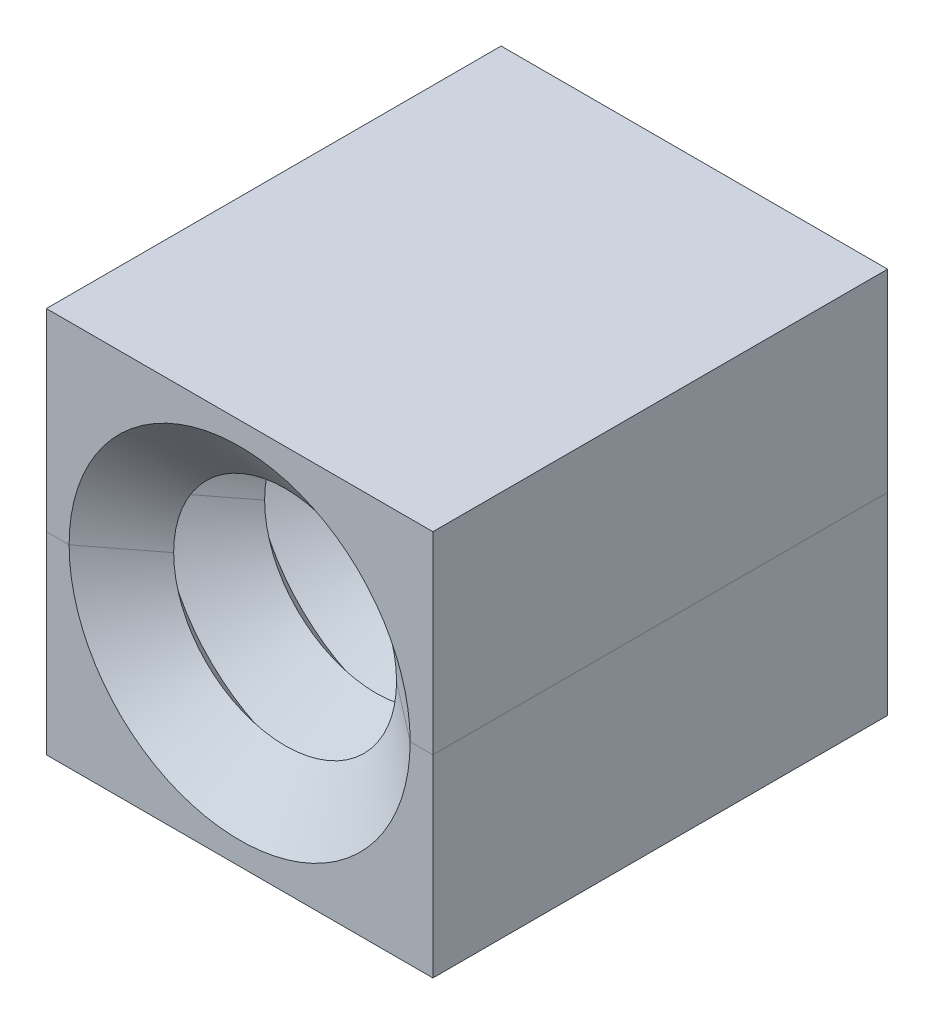
ISO-10303-21;
HEADER;
FILE_DESCRIPTION(('STEP AP214'),'2;1');
FILE_NAME('part.step','',(''),(''),'','','');
FILE_SCHEMA(('AUTOMOTIVE_DESIGN { 1 0 10303 214 1 1 1 1 }'));
ENDSEC;
DATA;
#1=APPLICATION_CONTEXT('core data for automotive mechanical design processes');
#2=APPLICATION_PROTOCOL_DEFINITION('international standard','automotive_design',2000,#1);
#3=PRODUCT_CONTEXT('',#1,'mechanical');
#4=PRODUCT('Part','Part','',(#3));
#5=PRODUCT_RELATED_PRODUCT_CATEGORY('part','',(#4));
#6=PRODUCT_DEFINITION_FORMATION('','',#4);
#7=PRODUCT_DEFINITION_CONTEXT('part definition',#1,'design');
#8=PRODUCT_DEFINITION('design','',#6,#7);
#9=PRODUCT_DEFINITION_SHAPE('','',#8);
#10=(LENGTH_UNIT() NAMED_UNIT(*) SI_UNIT(.MILLI.,.METRE.));
#11=(NAMED_UNIT(*) PLANE_ANGLE_UNIT() SI_UNIT($,.RADIAN.));
#12=(NAMED_UNIT(*) SI_UNIT($,.STERADIAN.) SOLID_ANGLE_UNIT());
#13=UNCERTAINTY_MEASURE_WITH_UNIT(LENGTH_MEASURE(1.E-05),#10,'distance_accuracy_value','');
#14=(GEOMETRIC_REPRESENTATION_CONTEXT(3) GLOBAL_UNCERTAINTY_ASSIGNED_CONTEXT((#13)) GLOBAL_UNIT_ASSIGNED_CONTEXT((#10,
#11,#12)) REPRESENTATION_CONTEXT('',''));
#15=CARTESIAN_POINT('',(0.,0.,0.));
#16=DIRECTION('',(0.,0.,1.));
#17=DIRECTION('',(1.,0.,0.));
#18=AXIS2_PLACEMENT_3D('',#15,#16,#17);
#19=CARTESIAN_POINT('',(0.,0.,0.));
#20=DIRECTION('',(0.,1.,0.));
#21=DIRECTION('',(0.,0.,1.));
#22=AXIS2_PLACEMENT_3D('',#19,#20,#21);
#23=PLANE('',#22);
#24=DIRECTION('',(0.792431530921342,0.,-0.609960874812195));
#25=VECTOR('',#24,1.);
#26=CARTESIAN_POINT('',(0.,0.,19.5459983167822));
#27=LINE('',#26,#25);
#28=CARTESIAN_POINT('',(15.,0.,7.99999999999999));
#29=VERTEX_POINT('',#28);
#30=CARTESIAN_POINT('',(9.80339435761134,0.,12.));
#31=VERTEX_POINT('',#30);
#32=EDGE_CURVE('E200',#29,#31,#27,.F.);
#33=ORIENTED_EDGE('',*,*,#32,.T.);
#34=DIRECTION('',(-0.792431530921343,0.,-0.609960874812194));
#35=VECTOR('',#34,1.);
#36=CARTESIAN_POINT('',(0.,0.,4.45400168321786));
#37=LINE('',#36,#35);
#38=CARTESIAN_POINT('',(15.,0.,16.));
#39=VERTEX_POINT('',#38);
#40=EDGE_CURVE('E411',#31,#39,#37,.F.);
#41=ORIENTED_EDGE('',*,*,#40,.T.);
#42=DIRECTION('',(0.792431530921342,0.,-0.609960874812195));
#43=VECTOR('',#42,1.);
#44=CARTESIAN_POINT('',(0.,0.,27.5459983167822));
#45=LINE('',#44,#43);
#46=CARTESIAN_POINT('',(9.80339435761134,0.,20.));
#47=VERTEX_POINT('',#46);
#48=EDGE_CURVE('E226',#39,#47,#45,.F.);
#49=ORIENTED_EDGE('',*,*,#48,.T.);
#50=DIRECTION('',(-0.792431530921343,0.,-0.609960874812194));
#51=VECTOR('',#50,1.);
#52=CARTESIAN_POINT('',(0.,0.,12.4540016832179));
#53=LINE('',#52,#51);
#54=CARTESIAN_POINT('',(15.,0.,24.));
#55=VERTEX_POINT('',#54);
#56=EDGE_CURVE('E234',#47,#55,#53,.F.);
#57=ORIENTED_EDGE('',*,*,#56,.T.);
#58=DIRECTION('',(0.792431530921342,0.,-0.609960874812195));
#59=VECTOR('',#58,1.);
#60=CARTESIAN_POINT('',(0.,0.,35.5459983167822));
#61=LINE('',#60,#59);
#62=CARTESIAN_POINT('',(9.80339435761134,0.,28.));
#63=VERTEX_POINT('',#62);
#64=EDGE_CURVE('E237',#55,#63,#61,.F.);
#65=ORIENTED_EDGE('',*,*,#64,.T.);
#66=DIRECTION('',(-0.792431530921343,0.,-0.609960874812194));
#67=VECTOR('',#66,1.);
#68=CARTESIAN_POINT('',(0.,0.,20.4540016832178));
#69=LINE('',#68,#67);
#70=CARTESIAN_POINT('',(15.,0.,32.));
#71=VERTEX_POINT('',#70);
#72=EDGE_CURVE('E246',#63,#71,#69,.F.);
#73=ORIENTED_EDGE('',*,*,#72,.T.);
#74=DIRECTION('',(1.,0.,0.));
#75=VECTOR('',#74,1.);
#76=CARTESIAN_POINT('',(-15.,0.,32.));
#77=LINE('',#76,#75);
#78=CARTESIAN_POINT('',(17.,0.,32.));
#79=VERTEX_POINT('',#78);
#80=EDGE_CURVE('E250',#71,#79,#77,.T.);
#81=ORIENTED_EDGE('',*,*,#80,.T.);
#82=DIRECTION('',(0.,0.,-1.));
#83=VECTOR('',#82,1.);
#84=CARTESIAN_POINT('',(17.,0.,35.));
#85=LINE('',#84,#83);
#86=CARTESIAN_POINT('',(17.,0.,-8.00000000000003));
#87=VERTEX_POINT('',#86);
#88=EDGE_CURVE('E157',#79,#87,#85,.T.);
#89=ORIENTED_EDGE('',*,*,#88,.T.);
#90=DIRECTION('',(-1.,0.,0.));
#91=VECTOR('',#90,1.);
#92=CARTESIAN_POINT('',(-11.3665165268692,0.,-8.00000000000003));
#93=LINE('',#92,#91);
#94=CARTESIAN_POINT('',(11.3665165268692,0.,-8.00000000000003));
#95=VERTEX_POINT('',#94);
#96=EDGE_CURVE('E158',#87,#95,#93,.T.);
#97=ORIENTED_EDGE('',*,*,#96,.T.);
#98=DIRECTION('',(-0.413531260199219,0.,-0.910489921326999));
#99=VECTOR('',#98,1.);
#100=CARTESIAN_POINT('',(0.,0.,-33.026158199807));
#101=LINE('',#100,#99);
#102=CARTESIAN_POINT('',(15.,0.,0.));
#103=VERTEX_POINT('',#102);
#104=EDGE_CURVE('E223',#95,#103,#101,.F.);
#105=ORIENTED_EDGE('',*,*,#104,.T.);
#106=DIRECTION('',(0.792431530921342,0.,-0.609960874812196));
#107=VECTOR('',#106,1.);
#108=CARTESIAN_POINT('',(0.,0.,11.5459983167822));
#109=LINE('',#108,#107);
#110=CARTESIAN_POINT('',(9.80339435761134,0.,4.));
#111=VERTEX_POINT('',#110);
#112=EDGE_CURVE('E214',#103,#111,#109,.F.);
#113=ORIENTED_EDGE('',*,*,#112,.T.);
#114=DIRECTION('',(-0.792431530921342,0.,-0.609960874812195));
#115=VECTOR('',#114,1.);
#116=CARTESIAN_POINT('',(0.,0.,-3.54599831678216));
#117=LINE('',#116,#115);
#118=EDGE_CURVE('E212',#111,#29,#117,.F.);
#119=ORIENTED_EDGE('',*,*,#118,.T.);
#120=EDGE_LOOP('',(#33,#41,#49,#57,#65,#73,#81,#89,#97,#105,#113,#119));
#121=FACE_BOUND('',#120,.T.);
#122=ADVANCED_FACE('F44',(#121),#23,.T.);
#123=DIRECTION('',(0.792431530921342,0.,0.609960874812195));
#124=VECTOR('',#123,1.);
#125=CARTESIAN_POINT('',(0.,0.,27.5459983167822));
#126=LINE('',#125,#124);
#127=CARTESIAN_POINT('',(-9.80339435761135,0.,20.));
#128=VERTEX_POINT('',#127);
#129=CARTESIAN_POINT('',(-15.,0.,16.));
#130=VERTEX_POINT('',#129);
#131=EDGE_CURVE('E229',#128,#130,#126,.F.);
#132=ORIENTED_EDGE('',*,*,#131,.T.);
#133=DIRECTION('',(-0.792431530921343,0.,0.609960874812194));
#134=VECTOR('',#133,1.);
#135=CARTESIAN_POINT('',(0.,0.,4.45400168321786));
#136=LINE('',#135,#134);
#137=CARTESIAN_POINT('',(-9.80339435761135,0.,12.));
#138=VERTEX_POINT('',#137);
#139=EDGE_CURVE('E171',#130,#138,#136,.F.);
#140=ORIENTED_EDGE('',*,*,#139,.T.);
#141=DIRECTION('',(0.792431530921342,0.,0.609960874812195));
#142=VECTOR('',#141,1.);
#143=CARTESIAN_POINT('',(0.,0.,19.5459983167822));
#144=LINE('',#143,#142);
#145=CARTESIAN_POINT('',(-15.,0.,7.99999999999999));
#146=VERTEX_POINT('',#145);
#147=EDGE_CURVE('E198',#138,#146,#144,.F.);
#148=ORIENTED_EDGE('',*,*,#147,.T.);
#149=DIRECTION('',(-0.792431530921342,0.,0.609960874812195));
#150=VECTOR('',#149,1.);
#151=CARTESIAN_POINT('',(0.,0.,-3.54599831678216));
#152=LINE('',#151,#150);
#153=CARTESIAN_POINT('',(-9.80339435761135,0.,4.));
#154=VERTEX_POINT('',#153);
#155=EDGE_CURVE('E207',#146,#154,#152,.F.);
#156=ORIENTED_EDGE('',*,*,#155,.T.);
#157=DIRECTION('',(0.792431530921342,0.,0.609960874812196));
#158=VECTOR('',#157,1.);
#159=CARTESIAN_POINT('',(0.,0.,11.5459983167822));
#160=LINE('',#159,#158);
#161=CARTESIAN_POINT('',(-15.,0.,0.));
#162=VERTEX_POINT('',#161);
#163=EDGE_CURVE('E220',#154,#162,#160,.F.);
#164=ORIENTED_EDGE('',*,*,#163,.T.);
#165=DIRECTION('',(-0.413531260199219,0.,0.910489921326999));
#166=VECTOR('',#165,1.);
#167=CARTESIAN_POINT('',(0.,0.,-33.026158199807));
#168=LINE('',#167,#166);
#169=CARTESIAN_POINT('',(-11.3665165268692,0.,-8.00000000000003));
#170=VERTEX_POINT('',#169);
#171=EDGE_CURVE('E165',#162,#170,#168,.F.);
#172=ORIENTED_EDGE('',*,*,#171,.T.);
#173=CARTESIAN_POINT('',(-17.,0.,-8.00000000000003));
#174=VERTEX_POINT('',#173);
#175=EDGE_CURVE('E145',#170,#174,#93,.T.);
#176=ORIENTED_EDGE('',*,*,#175,.T.);
#177=DIRECTION('',(0.,0.,1.));
#178=VECTOR('',#177,1.);
#179=CARTESIAN_POINT('',(-17.,0.,35.));
#180=LINE('',#179,#178);
#181=CARTESIAN_POINT('',(-17.,0.,32.));
#182=VERTEX_POINT('',#181);
#183=EDGE_CURVE('E153',#174,#182,#180,.T.);
#184=ORIENTED_EDGE('',*,*,#183,.T.);
#185=CARTESIAN_POINT('',(-15.,0.,32.));
#186=VERTEX_POINT('',#185);
#187=EDGE_CURVE('E249',#182,#186,#77,.T.);
#188=ORIENTED_EDGE('',*,*,#187,.T.);
#189=DIRECTION('',(-0.792431530921343,0.,0.609960874812194));
#190=VECTOR('',#189,1.);
#191=CARTESIAN_POINT('',(0.,0.,20.4540016832178));
#192=LINE('',#191,#190);
#193=CARTESIAN_POINT('',(-9.80339435761135,0.,28.));
#194=VERTEX_POINT('',#193);
#195=EDGE_CURVE('E243',#186,#194,#192,.F.);
#196=ORIENTED_EDGE('',*,*,#195,.T.);
#197=DIRECTION('',(0.792431530921342,0.,0.609960874812195));
#198=VECTOR('',#197,1.);
#199=CARTESIAN_POINT('',(0.,0.,35.5459983167822));
#200=LINE('',#199,#198);
#201=CARTESIAN_POINT('',(-15.,0.,24.));
#202=VERTEX_POINT('',#201);
#203=EDGE_CURVE('E240',#194,#202,#200,.F.);
#204=ORIENTED_EDGE('',*,*,#203,.T.);
#205=DIRECTION('',(-0.792431530921343,0.,0.609960874812194));
#206=VECTOR('',#205,1.);
#207=CARTESIAN_POINT('',(0.,0.,12.4540016832179));
#208=LINE('',#207,#206);
#209=EDGE_CURVE('E231',#202,#128,#208,.F.);
#210=ORIENTED_EDGE('',*,*,#209,.T.);
#211=EDGE_LOOP('',(#132,#140,#148,#156,#164,#172,#176,#184,#188,#196,#204,#210));
#212=FACE_BOUND('',#211,.T.);
#213=ADVANCED_FACE('F162',(#212),#23,.T.);
#214=CARTESIAN_POINT('',(0.,0.,12.));
#215=DIRECTION('',(0.,0.,1.));
#216=DIRECTION('',(1.,0.,0.));
#217=AXIS2_PLACEMENT_3D('',#214,#215,#216);
#218=CONICAL_SURFACE('',#217,9.80339435761135,0.914785110396087);
#219=ORIENTED_EDGE('',*,*,#139,.F.);
#220=CARTESIAN_POINT('',(0.,0.,16.));
#221=DIRECTION('',(0.,0.,-1.));
#222=DIRECTION('',(-1.,0.,0.));
#223=AXIS2_PLACEMENT_3D('',#220,#221,#222);
#224=CIRCLE('',#223,15.);
#225=EDGE_CURVE('E190',#39,#130,#224,.T.);
#226=ORIENTED_EDGE('',*,*,#225,.F.);
#227=ORIENTED_EDGE('',*,*,#40,.F.);
#228=CARTESIAN_POINT('',(0.,0.,12.));
#229=DIRECTION('',(0.,0.,-1.));
#230=DIRECTION('',(-1.,0.,0.));
#231=AXIS2_PLACEMENT_3D('',#228,#229,#230);
#232=CIRCLE('',#231,9.80339435761135);
#233=EDGE_CURVE('E192',#31,#138,#232,.T.);
#234=ORIENTED_EDGE('',*,*,#233,.T.);
#235=EDGE_LOOP('',(#219,#226,#227,#234));
#236=FACE_BOUND('',#235,.T.);
#237=ADVANCED_FACE('F273',(#236),#218,.F.);
#238=CARTESIAN_POINT('',(0.,0.,7.99999999999999));
#239=DIRECTION('',(0.,0.,-1.));
#240=DIRECTION('',(-1.,0.,0.));
#241=AXIS2_PLACEMENT_3D('',#238,#239,#240);
#242=CONICAL_SURFACE('',#241,15.,0.914785110396086);
#243=ORIENTED_EDGE('',*,*,#32,.F.);
#244=CARTESIAN_POINT('',(0.,0.,7.99999999999999));
#245=DIRECTION('',(0.,0.,-1.));
#246=DIRECTION('',(-1.,0.,0.));
#247=AXIS2_PLACEMENT_3D('',#244,#245,#246);
#248=CIRCLE('',#247,15.);
#249=EDGE_CURVE('E53',#29,#146,#248,.T.);
#250=ORIENTED_EDGE('',*,*,#249,.T.);
#251=ORIENTED_EDGE('',*,*,#147,.F.);
#252=ORIENTED_EDGE('',*,*,#233,.F.);
#253=EDGE_LOOP('',(#243,#250,#251,#252));
#254=FACE_BOUND('',#253,.T.);
#255=ADVANCED_FACE('F197',(#254),#242,.F.);
#256=CARTESIAN_POINT('',(0.,0.,4.));
#257=DIRECTION('',(0.,0.,1.));
#258=DIRECTION('',(1.,0.,0.));
#259=AXIS2_PLACEMENT_3D('',#256,#257,#258);
#260=CONICAL_SURFACE('',#259,9.80339435761135,0.914785110396086);
#261=ORIENTED_EDGE('',*,*,#155,.F.);
#262=ORIENTED_EDGE('',*,*,#249,.F.);
#263=ORIENTED_EDGE('',*,*,#118,.F.);
#264=CARTESIAN_POINT('',(0.,0.,4.));
#265=DIRECTION('',(0.,0.,-1.));
#266=DIRECTION('',(-1.,0.,0.));
#267=AXIS2_PLACEMENT_3D('',#264,#265,#266);
#268=CIRCLE('',#267,9.80339435761135);
#269=EDGE_CURVE('E12',#111,#154,#268,.T.);
#270=ORIENTED_EDGE('',*,*,#269,.T.);
#271=EDGE_LOOP('',(#261,#262,#263,#270));
#272=FACE_BOUND('',#271,.T.);
#273=ADVANCED_FACE('F211',(#272),#260,.F.);
#274=CARTESIAN_POINT('',(0.,0.,0.));
#275=DIRECTION('',(0.,0.,-1.));
#276=DIRECTION('',(-1.,0.,0.));
#277=AXIS2_PLACEMENT_3D('',#274,#275,#276);
#278=CONICAL_SURFACE('',#277,15.,0.914785110396085);
#279=ORIENTED_EDGE('',*,*,#112,.F.);
#280=CARTESIAN_POINT('',(0.,0.,0.));
#281=DIRECTION('',(0.,0.,-1.));
#282=DIRECTION('',(-1.,0.,0.));
#283=AXIS2_PLACEMENT_3D('',#280,#281,#282);
#284=CIRCLE('',#283,15.);
#285=EDGE_CURVE('E181',#103,#162,#284,.T.);
#286=ORIENTED_EDGE('',*,*,#285,.T.);
#287=ORIENTED_EDGE('',*,*,#163,.F.);
#288=ORIENTED_EDGE('',*,*,#269,.F.);
#289=EDGE_LOOP('',(#279,#286,#287,#288));
#290=FACE_BOUND('',#289,.T.);
#291=ADVANCED_FACE('F262',(#290),#278,.F.);
#292=CARTESIAN_POINT('',(0.,0.,-8.00000000000003));
#293=DIRECTION('',(0.,0.,1.));
#294=DIRECTION('',(1.,0.,0.));
#295=AXIS2_PLACEMENT_3D('',#292,#293,#294);
#296=CONICAL_SURFACE('',#295,11.3665165268692,0.426329079589016);
#297=ORIENTED_EDGE('',*,*,#171,.F.);
#298=ORIENTED_EDGE('',*,*,#285,.F.);
#299=ORIENTED_EDGE('',*,*,#104,.F.);
#300=CARTESIAN_POINT('',(0.,0.,-8.00000000000003));
#301=DIRECTION('',(0.,0.,1.));
#302=DIRECTION('',(1.,0.,0.));
#303=AXIS2_PLACEMENT_3D('',#300,#301,#302);
#304=CIRCLE('',#303,11.3665165268692);
#305=EDGE_CURVE('E170',#95,#170,#304,.F.);
#306=ORIENTED_EDGE('',*,*,#305,.T.);
#307=EDGE_LOOP('',(#297,#298,#299,#306));
#308=FACE_BOUND('',#307,.T.);
#309=ADVANCED_FACE('F259',(#308),#296,.F.);
#310=CARTESIAN_POINT('',(0.,0.,16.));
#311=DIRECTION('',(0.,0.,-1.));
#312=DIRECTION('',(-1.,0.,0.));
#313=AXIS2_PLACEMENT_3D('',#310,#311,#312);
#314=CONICAL_SURFACE('',#313,15.,0.914785110396086);
#315=ORIENTED_EDGE('',*,*,#48,.F.);
#316=ORIENTED_EDGE('',*,*,#225,.T.);
#317=ORIENTED_EDGE('',*,*,#131,.F.);
#318=CARTESIAN_POINT('',(0.,0.,20.));
#319=DIRECTION('',(0.,0.,-1.));
#320=DIRECTION('',(-1.,0.,0.));
#321=AXIS2_PLACEMENT_3D('',#318,#319,#320);
#322=CIRCLE('',#321,9.80339435761135);
#323=EDGE_CURVE('E188',#47,#128,#322,.T.);
#324=ORIENTED_EDGE('',*,*,#323,.F.);
#325=EDGE_LOOP('',(#315,#316,#317,#324));
#326=FACE_BOUND('',#325,.T.);
#327=ADVANCED_FACE('F269',(#326),#314,.F.);
#328=CARTESIAN_POINT('',(0.,0.,20.));
#329=DIRECTION('',(0.,0.,1.));
#330=DIRECTION('',(1.,0.,0.));
#331=AXIS2_PLACEMENT_3D('',#328,#329,#330);
#332=CONICAL_SURFACE('',#331,9.80339435761135,0.914785110396087);
#333=ORIENTED_EDGE('',*,*,#209,.F.);
#334=CARTESIAN_POINT('',(0.,0.,24.));
#335=DIRECTION('',(0.,0.,-1.));
#336=DIRECTION('',(-1.,0.,0.));
#337=AXIS2_PLACEMENT_3D('',#334,#335,#336);
#338=CIRCLE('',#337,15.);
#339=EDGE_CURVE('E186',#55,#202,#338,.T.);
#340=ORIENTED_EDGE('',*,*,#339,.F.);
#341=ORIENTED_EDGE('',*,*,#56,.F.);
#342=ORIENTED_EDGE('',*,*,#323,.T.);
#343=EDGE_LOOP('',(#333,#340,#341,#342));
#344=FACE_BOUND('',#343,.T.);
#345=ADVANCED_FACE('F286',(#344),#332,.F.);
#346=CARTESIAN_POINT('',(0.,0.,24.));
#347=DIRECTION('',(0.,0.,-1.));
#348=DIRECTION('',(-1.,0.,0.));
#349=AXIS2_PLACEMENT_3D('',#346,#347,#348);
#350=CONICAL_SURFACE('',#349,15.,0.914785110396086);
#351=ORIENTED_EDGE('',*,*,#64,.F.);
#352=ORIENTED_EDGE('',*,*,#339,.T.);
#353=ORIENTED_EDGE('',*,*,#203,.F.);
#354=CARTESIAN_POINT('',(0.,0.,28.));
#355=DIRECTION('',(0.,0.,-1.));
#356=DIRECTION('',(-1.,0.,0.));
#357=AXIS2_PLACEMENT_3D('',#354,#355,#356);
#358=CIRCLE('',#357,9.80339435761135);
#359=EDGE_CURVE('E184',#63,#194,#358,.T.);
#360=ORIENTED_EDGE('',*,*,#359,.F.);
#361=EDGE_LOOP('',(#351,#352,#353,#360));
#362=FACE_BOUND('',#361,.T.);
#363=ADVANCED_FACE('F290',(#362),#350,.F.);
#364=CARTESIAN_POINT('',(0.,0.,28.));
#365=DIRECTION('',(0.,0.,1.));
#366=DIRECTION('',(1.,0.,0.));
#367=AXIS2_PLACEMENT_3D('',#364,#365,#366);
#368=CONICAL_SURFACE('',#367,9.80339435761135,0.914785110396087);
#369=ORIENTED_EDGE('',*,*,#195,.F.);
#370=CARTESIAN_POINT('',(0.,0.,32.));
#371=DIRECTION('',(0.,0.,-1.));
#372=DIRECTION('',(-1.,0.,0.));
#373=AXIS2_PLACEMENT_3D('',#370,#371,#372);
#374=CIRCLE('',#373,15.);
#375=EDGE_CURVE('E179',#71,#186,#374,.T.);
#376=ORIENTED_EDGE('',*,*,#375,.F.);
#377=ORIENTED_EDGE('',*,*,#72,.F.);
#378=ORIENTED_EDGE('',*,*,#359,.T.);
#379=EDGE_LOOP('',(#369,#376,#377,#378));
#380=FACE_BOUND('',#379,.T.);
#381=ADVANCED_FACE('F294',(#380),#368,.F.);
#382=CARTESIAN_POINT('',(-15.,0.,32.));
#383=DIRECTION('',(0.,0.,-1.));
#384=DIRECTION('',(-1.,0.,0.));
#385=AXIS2_PLACEMENT_3D('',#382,#383,#384);
#386=PLANE('',#385);
#387=ORIENTED_EDGE('',*,*,#187,.F.);
#388=DIRECTION('',(0.,1.,0.));
#389=VECTOR('',#388,1.);
#390=CARTESIAN_POINT('',(-17.,17.,32.));
#391=LINE('',#390,#389);
#392=CARTESIAN_POINT('',(-17.,-17.,32.));
#393=VERTEX_POINT('',#392);
#394=EDGE_CURVE('E59',#393,#182,#391,.T.);
#395=ORIENTED_EDGE('',*,*,#394,.F.);
#396=DIRECTION('',(-1.,0.,0.));
#397=VECTOR('',#396,1.);
#398=CARTESIAN_POINT('',(-17.,-17.,32.));
#399=LINE('',#398,#397);
#400=CARTESIAN_POINT('',(17.,-17.,32.));
#401=VERTEX_POINT('',#400);
#402=EDGE_CURVE('E182',#401,#393,#399,.T.);
#403=ORIENTED_EDGE('',*,*,#402,.F.);
#404=DIRECTION('',(0.,-1.,0.));
#405=VECTOR('',#404,1.);
#406=CARTESIAN_POINT('',(17.,17.,32.));
#407=LINE('',#406,#405);
#408=EDGE_CURVE('E175',#79,#401,#407,.T.);
#409=ORIENTED_EDGE('',*,*,#408,.F.);
#410=ORIENTED_EDGE('',*,*,#80,.F.);
#411=ORIENTED_EDGE('',*,*,#375,.T.);
#412=EDGE_LOOP('',(#387,#395,#403,#409,#410,#411));
#413=FACE_BOUND('',#412,.T.);
#414=ADVANCED_FACE('F298',(#413),#386,.F.);
#415=CARTESIAN_POINT('',(17.,17.,35.));
#416=DIRECTION('',(-1.,0.,0.));
#417=DIRECTION('',(0.,-1.,0.));
#418=AXIS2_PLACEMENT_3D('',#415,#416,#417);
#419=PLANE('',#418);
#420=ORIENTED_EDGE('',*,*,#88,.F.);
#421=ORIENTED_EDGE('',*,*,#408,.T.);
#422=DIRECTION('',(0.,0.,-1.));
#423=VECTOR('',#422,1.);
#424=CARTESIAN_POINT('',(17.,-17.,35.));
#425=LINE('',#424,#423);
#426=CARTESIAN_POINT('',(17.,-17.,-8.00000000000003));
#427=VERTEX_POINT('',#426);
#428=EDGE_CURVE('E174',#401,#427,#425,.T.);
#429=ORIENTED_EDGE('',*,*,#428,.T.);
#430=DIRECTION('',(0.,1.,0.));
#431=VECTOR('',#430,1.);
#432=CARTESIAN_POINT('',(17.,17.,-8.00000000000003));
#433=LINE('',#432,#431);
#434=EDGE_CURVE('E150',#427,#87,#433,.T.);
#435=ORIENTED_EDGE('',*,*,#434,.T.);
#436=EDGE_LOOP('',(#420,#421,#429,#435));
#437=FACE_BOUND('',#436,.T.);
#438=ADVANCED_FACE('F302',(#437),#419,.F.);
#439=CARTESIAN_POINT('',(-17.,17.,35.));
#440=DIRECTION('',(1.,0.,0.));
#441=DIRECTION('',(0.,1.,0.));
#442=AXIS2_PLACEMENT_3D('',#439,#440,#441);
#443=PLANE('',#442);
#444=ORIENTED_EDGE('',*,*,#183,.F.);
#445=DIRECTION('',(0.,-1.,0.));
#446=VECTOR('',#445,1.);
#447=CARTESIAN_POINT('',(-17.,17.,-8.00000000000003));
#448=LINE('',#447,#446);
#449=CARTESIAN_POINT('',(-17.,-17.,-8.00000000000003));
#450=VERTEX_POINT('',#449);
#451=EDGE_CURVE('E141',#174,#450,#448,.T.);
#452=ORIENTED_EDGE('',*,*,#451,.T.);
#453=DIRECTION('',(0.,0.,-1.));
#454=VECTOR('',#453,1.);
#455=CARTESIAN_POINT('',(-17.,-17.,35.));
#456=LINE('',#455,#454);
#457=EDGE_CURVE('E178',#393,#450,#456,.T.);
#458=ORIENTED_EDGE('',*,*,#457,.F.);
#459=ORIENTED_EDGE('',*,*,#394,.T.);
#460=EDGE_LOOP('',(#444,#452,#458,#459));
#461=FACE_BOUND('',#460,.T.);
#462=ADVANCED_FACE('F154',(#461),#443,.F.);
#463=CARTESIAN_POINT('',(-11.3665165268692,0.,-8.00000000000003));
#464=DIRECTION('',(0.,0.,1.));
#465=DIRECTION('',(1.,0.,0.));
#466=AXIS2_PLACEMENT_3D('',#463,#464,#465);
#467=PLANE('',#466);
#468=ORIENTED_EDGE('',*,*,#96,.F.);
#469=ORIENTED_EDGE('',*,*,#434,.F.);
#470=DIRECTION('',(1.,0.,0.));
#471=VECTOR('',#470,1.);
#472=CARTESIAN_POINT('',(-17.,-17.,-8.00000000000003));
#473=LINE('',#472,#471);
#474=EDGE_CURVE('E147',#450,#427,#473,.T.);
#475=ORIENTED_EDGE('',*,*,#474,.F.);
#476=ORIENTED_EDGE('',*,*,#451,.F.);
#477=ORIENTED_EDGE('',*,*,#175,.F.);
#478=ORIENTED_EDGE('',*,*,#305,.F.);
#479=EDGE_LOOP('',(#468,#469,#475,#476,#477,#478));
#480=FACE_BOUND('',#479,.T.);
#481=ADVANCED_FACE('F46',(#480),#467,.F.);
#482=CARTESIAN_POINT('',(-17.,-17.,35.));
#483=DIRECTION('',(0.,1.,0.));
#484=DIRECTION('',(0.,0.,1.));
#485=AXIS2_PLACEMENT_3D('',#482,#483,#484);
#486=PLANE('',#485);
#487=ORIENTED_EDGE('',*,*,#457,.T.);
#488=ORIENTED_EDGE('',*,*,#474,.T.);
#489=ORIENTED_EDGE('',*,*,#428,.F.);
#490=ORIENTED_EDGE('',*,*,#402,.T.);
#491=EDGE_LOOP('',(#487,#488,#489,#490));
#492=FACE_BOUND('',#491,.T.);
#493=ADVANCED_FACE('F282',(#492),#486,.F.);
#494=CLOSED_SHELL('',(#122,#213,#237,#255,#273,#291,#309,#327,#345,#363,#381,#414,#438,#462,
#481,#493));
#495=MANIFOLD_SOLID_BREP('B2',#494);
#496=CARTESIAN_POINT('',(0.,0.,0.));
#497=DIRECTION('',(0.,1.,0.));
#498=DIRECTION('',(0.,0.,1.));
#499=AXIS2_PLACEMENT_3D('',#496,#497,#498);
#500=PLANE('',#499);
#501=DIRECTION('',(0.792431530921342,0.,-0.609960874812195));
#502=VECTOR('',#501,1.);
#503=CARTESIAN_POINT('',(0.,0.,19.5459983167822));
#504=LINE('',#503,#502);
#505=CARTESIAN_POINT('',(15.,0.,7.99999999999999));
#506=VERTEX_POINT('',#505);
#507=CARTESIAN_POINT('',(9.80339435761134,0.,12.));
#508=VERTEX_POINT('',#507);
#509=EDGE_CURVE('E592',#506,#508,#504,.F.);
#510=ORIENTED_EDGE('',*,*,#509,.F.);
#511=DIRECTION('',(-0.792431530921342,0.,-0.609960874812195));
#512=VECTOR('',#511,1.);
#513=CARTESIAN_POINT('',(0.,0.,-3.54599831678216));
#514=LINE('',#513,#512);
#515=CARTESIAN_POINT('',(9.80339435761134,0.,4.));
#516=VERTEX_POINT('',#515);
#517=EDGE_CURVE('E591',#516,#506,#514,.F.);
#518=ORIENTED_EDGE('',*,*,#517,.F.);
#519=DIRECTION('',(0.792431530921342,0.,-0.609960874812196));
#520=VECTOR('',#519,1.);
#521=CARTESIAN_POINT('',(0.,0.,11.5459983167822));
#522=LINE('',#521,#520);
#523=CARTESIAN_POINT('',(15.,0.,0.));
#524=VERTEX_POINT('',#523);
#525=EDGE_CURVE('E587',#524,#516,#522,.F.);
#526=ORIENTED_EDGE('',*,*,#525,.F.);
#527=DIRECTION('',(-0.413531260199219,0.,-0.910489921326999));
#528=VECTOR('',#527,1.);
#529=CARTESIAN_POINT('',(0.,0.,-33.026158199807));
#530=LINE('',#529,#528);
#531=CARTESIAN_POINT('',(11.3665165268692,0.,-8.00000000000003));
#532=VERTEX_POINT('',#531);
#533=EDGE_CURVE('E585',#532,#524,#530,.F.);
#534=ORIENTED_EDGE('',*,*,#533,.F.);
#535=DIRECTION('',(-1.,0.,0.));
#536=VECTOR('',#535,1.);
#537=CARTESIAN_POINT('',(-11.3665165268692,0.,-8.00000000000003));
#538=LINE('',#537,#536);
#539=CARTESIAN_POINT('',(17.,0.,-8.00000000000003));
#540=VERTEX_POINT('',#539);
#541=EDGE_CURVE('E562',#540,#532,#538,.T.);
#542=ORIENTED_EDGE('',*,*,#541,.F.);
#543=DIRECTION('',(0.,0.,-1.));
#544=VECTOR('',#543,1.);
#545=CARTESIAN_POINT('',(17.,0.,35.));
#546=LINE('',#545,#544);
#547=CARTESIAN_POINT('',(17.,0.,32.));
#548=VERTEX_POINT('',#547);
#549=EDGE_CURVE('E565',#548,#540,#546,.T.);
#550=ORIENTED_EDGE('',*,*,#549,.F.);
#551=DIRECTION('',(1.,0.,0.));
#552=VECTOR('',#551,1.);
#553=CARTESIAN_POINT('',(-15.,0.,32.));
#554=LINE('',#553,#552);
#555=CARTESIAN_POINT('',(15.,0.,32.));
#556=VERTEX_POINT('',#555);
#557=EDGE_CURVE('E569',#556,#548,#554,.T.);
#558=ORIENTED_EDGE('',*,*,#557,.F.);
#559=DIRECTION('',(-0.792431530921343,0.,-0.609960874812194));
#560=VECTOR('',#559,1.);
#561=CARTESIAN_POINT('',(0.,0.,20.4540016832178));
#562=LINE('',#561,#560);
#563=CARTESIAN_POINT('',(9.80339435761134,0.,28.));
#564=VERTEX_POINT('',#563);
#565=EDGE_CURVE('E568',#564,#556,#562,.F.);
#566=ORIENTED_EDGE('',*,*,#565,.F.);
#567=DIRECTION('',(0.792431530921342,0.,-0.609960874812195));
#568=VECTOR('',#567,1.);
#569=CARTESIAN_POINT('',(0.,0.,35.5459983167822));
#570=LINE('',#569,#568);
#571=CARTESIAN_POINT('',(15.,0.,24.));
#572=VERTEX_POINT('',#571);
#573=EDGE_CURVE('E574',#572,#564,#570,.F.);
#574=ORIENTED_EDGE('',*,*,#573,.F.);
#575=DIRECTION('',(-0.792431530921343,0.,-0.609960874812194));
#576=VECTOR('',#575,1.);
#577=CARTESIAN_POINT('',(0.,0.,12.4540016832179));
#578=LINE('',#577,#576);
#579=CARTESIAN_POINT('',(9.80339435761134,0.,20.));
#580=VERTEX_POINT('',#579);
#581=EDGE_CURVE('E578',#580,#572,#578,.F.);
#582=ORIENTED_EDGE('',*,*,#581,.F.);
#583=DIRECTION('',(0.792431530921342,0.,-0.609960874812195));
#584=VECTOR('',#583,1.);
#585=CARTESIAN_POINT('',(0.,0.,27.5459983167822));
#586=LINE('',#585,#584);
#587=CARTESIAN_POINT('',(15.,0.,16.));
#588=VERTEX_POINT('',#587);
#589=EDGE_CURVE('E581',#588,#580,#586,.F.);
#590=ORIENTED_EDGE('',*,*,#589,.F.);
#591=DIRECTION('',(-0.792431530921343,0.,-0.609960874812194));
#592=VECTOR('',#591,1.);
#593=CARTESIAN_POINT('',(0.,0.,4.45400168321786));
#594=LINE('',#593,#592);
#595=EDGE_CURVE('E427',#508,#588,#594,.F.);
#596=ORIENTED_EDGE('',*,*,#595,.F.);
#597=EDGE_LOOP('',(#510,#518,#526,#534,#542,#550,#558,#566,#574,#582,#590,#596));
#598=FACE_BOUND('',#597,.T.);
#599=ADVANCED_FACE('F424',(#598),#500,.F.);
#600=DIRECTION('',(0.792431530921342,0.,0.609960874812195));
#601=VECTOR('',#600,1.);
#602=CARTESIAN_POINT('',(0.,0.,27.5459983167822));
#603=LINE('',#602,#601);
#604=CARTESIAN_POINT('',(-9.80339435761135,0.,20.));
#605=VERTEX_POINT('',#604);
#606=CARTESIAN_POINT('',(-15.,0.,16.));
#607=VERTEX_POINT('',#606);
#608=EDGE_CURVE('E577',#605,#607,#603,.F.);
#609=ORIENTED_EDGE('',*,*,#608,.F.);
#610=DIRECTION('',(-0.792431530921343,0.,0.609960874812194));
#611=VECTOR('',#610,1.);
#612=CARTESIAN_POINT('',(0.,0.,12.4540016832179));
#613=LINE('',#612,#611);
#614=CARTESIAN_POINT('',(-15.,0.,24.));
#615=VERTEX_POINT('',#614);
#616=EDGE_CURVE('E575',#615,#605,#613,.F.);
#617=ORIENTED_EDGE('',*,*,#616,.F.);
#618=DIRECTION('',(0.792431530921342,0.,0.609960874812195));
#619=VECTOR('',#618,1.);
#620=CARTESIAN_POINT('',(0.,0.,35.5459983167822));
#621=LINE('',#620,#619);
#622=CARTESIAN_POINT('',(-9.80339435761135,0.,28.));
#623=VERTEX_POINT('',#622);
#624=EDGE_CURVE('E572',#623,#615,#621,.F.);
#625=ORIENTED_EDGE('',*,*,#624,.F.);
#626=DIRECTION('',(-0.792431530921343,0.,0.609960874812194));
#627=VECTOR('',#626,1.);
#628=CARTESIAN_POINT('',(0.,0.,20.4540016832178));
#629=LINE('',#628,#627);
#630=CARTESIAN_POINT('',(-15.,0.,32.));
#631=VERTEX_POINT('',#630);
#632=EDGE_CURVE('E570',#631,#623,#629,.F.);
#633=ORIENTED_EDGE('',*,*,#632,.F.);
#634=CARTESIAN_POINT('',(-17.,0.,32.));
#635=VERTEX_POINT('',#634);
#636=EDGE_CURVE('E566',#635,#631,#554,.T.);
#637=ORIENTED_EDGE('',*,*,#636,.F.);
#638=DIRECTION('',(0.,0.,1.));
#639=VECTOR('',#638,1.);
#640=CARTESIAN_POINT('',(-17.,0.,35.));
#641=LINE('',#640,#639);
#642=CARTESIAN_POINT('',(-17.,0.,-8.00000000000003));
#643=VERTEX_POINT('',#642);
#644=EDGE_CURVE('E532',#643,#635,#641,.T.);
#645=ORIENTED_EDGE('',*,*,#644,.F.);
#646=CARTESIAN_POINT('',(-11.3665165268692,0.,-8.00000000000003));
#647=VERTEX_POINT('',#646);
#648=EDGE_CURVE('E560',#647,#643,#538,.T.);
#649=ORIENTED_EDGE('',*,*,#648,.F.);
#650=DIRECTION('',(-0.413531260199219,0.,0.910489921326999));
#651=VECTOR('',#650,1.);
#652=CARTESIAN_POINT('',(0.,0.,-33.026158199807));
#653=LINE('',#652,#651);
#654=CARTESIAN_POINT('',(-15.,0.,0.));
#655=VERTEX_POINT('',#654);
#656=EDGE_CURVE('E582',#655,#647,#653,.F.);
#657=ORIENTED_EDGE('',*,*,#656,.F.);
#658=DIRECTION('',(0.792431530921342,0.,0.609960874812196));
#659=VECTOR('',#658,1.);
#660=CARTESIAN_POINT('',(0.,0.,11.5459983167822));
#661=LINE('',#660,#659);
#662=CARTESIAN_POINT('',(-9.80339435761135,0.,4.));
#663=VERTEX_POINT('',#662);
#664=EDGE_CURVE('E584',#663,#655,#661,.F.);
#665=ORIENTED_EDGE('',*,*,#664,.F.);
#666=DIRECTION('',(-0.792431530921342,0.,0.609960874812195));
#667=VECTOR('',#666,1.);
#668=CARTESIAN_POINT('',(0.,0.,-3.54599831678216));
#669=LINE('',#668,#667);
#670=CARTESIAN_POINT('',(-15.,0.,7.99999999999999));
#671=VERTEX_POINT('',#670);
#672=EDGE_CURVE('E588',#671,#663,#669,.F.);
#673=ORIENTED_EDGE('',*,*,#672,.F.);
#674=DIRECTION('',(0.792431530921342,0.,0.609960874812195));
#675=VECTOR('',#674,1.);
#676=CARTESIAN_POINT('',(0.,0.,19.5459983167822));
#677=LINE('',#676,#675);
#678=CARTESIAN_POINT('',(-9.80339435761135,0.,12.));
#679=VERTEX_POINT('',#678);
#680=EDGE_CURVE('E590',#679,#671,#677,.F.);
#681=ORIENTED_EDGE('',*,*,#680,.F.);
#682=DIRECTION('',(-0.792431530921343,0.,0.609960874812194));
#683=VECTOR('',#682,1.);
#684=CARTESIAN_POINT('',(0.,0.,4.45400168321786));
#685=LINE('',#684,#683);
#686=EDGE_CURVE('E42',#607,#679,#685,.F.);
#687=ORIENTED_EDGE('',*,*,#686,.F.);
#688=EDGE_LOOP('',(#609,#617,#625,#633,#637,#645,#649,#657,#665,#673,#681,#687));
#689=FACE_BOUND('',#688,.T.);
#690=ADVANCED_FACE('F641',(#689),#500,.F.);
#691=CARTESIAN_POINT('',(0.,0.,7.99999999999999));
#692=DIRECTION('',(0.,0.,-1.));
#693=DIRECTION('',(-1.,0.,0.));
#694=AXIS2_PLACEMENT_3D('',#691,#692,#693);
#695=CONICAL_SURFACE('',#694,15.,0.914785110396086);
#696=CARTESIAN_POINT('',(0.,0.,7.99999999999999));
#697=DIRECTION('',(0.,0.,-1.));
#698=DIRECTION('',(-1.,0.,0.));
#699=AXIS2_PLACEMENT_3D('',#696,#697,#698);
#700=CIRCLE('',#699,15.);
#701=EDGE_CURVE('E619',#671,#506,#700,.T.);
#702=ORIENTED_EDGE('',*,*,#701,.T.);
#703=ORIENTED_EDGE('',*,*,#509,.T.);
#704=CARTESIAN_POINT('',(0.,0.,12.));
#705=DIRECTION('',(0.,0.,-1.));
#706=DIRECTION('',(-1.,0.,0.));
#707=AXIS2_PLACEMENT_3D('',#704,#705,#706);
#708=CIRCLE('',#707,9.80339435761135);
#709=EDGE_CURVE('E607',#679,#508,#708,.T.);
#710=ORIENTED_EDGE('',*,*,#709,.F.);
#711=ORIENTED_EDGE('',*,*,#680,.T.);
#712=EDGE_LOOP('',(#702,#703,#710,#711));
#713=FACE_BOUND('',#712,.T.);
#714=ADVANCED_FACE('F639',(#713),#695,.F.);
#715=CARTESIAN_POINT('',(0.,0.,4.));
#716=DIRECTION('',(0.,0.,1.));
#717=DIRECTION('',(1.,0.,0.));
#718=AXIS2_PLACEMENT_3D('',#715,#716,#717);
#719=CONICAL_SURFACE('',#718,9.80339435761135,0.914785110396086);
#720=ORIENTED_EDGE('',*,*,#701,.F.);
#721=ORIENTED_EDGE('',*,*,#672,.T.);
#722=CARTESIAN_POINT('',(0.,0.,4.));
#723=DIRECTION('',(0.,0.,-1.));
#724=DIRECTION('',(-1.,0.,0.));
#725=AXIS2_PLACEMENT_3D('',#722,#723,#724);
#726=CIRCLE('',#725,9.80339435761135);
#727=EDGE_CURVE('E623',#663,#516,#726,.T.);
#728=ORIENTED_EDGE('',*,*,#727,.T.);
#729=ORIENTED_EDGE('',*,*,#517,.T.);
#730=EDGE_LOOP('',(#720,#721,#728,#729));
#731=FACE_BOUND('',#730,.T.);
#732=ADVANCED_FACE('F628',(#731),#719,.F.);
#733=CARTESIAN_POINT('',(0.,0.,0.));
#734=DIRECTION('',(0.,0.,-1.));
#735=DIRECTION('',(-1.,0.,0.));
#736=AXIS2_PLACEMENT_3D('',#733,#734,#735);
#737=CONICAL_SURFACE('',#736,15.,0.914785110396085);
#738=CARTESIAN_POINT('',(0.,0.,0.));
#739=DIRECTION('',(0.,0.,-1.));
#740=DIRECTION('',(-1.,0.,0.));
#741=AXIS2_PLACEMENT_3D('',#738,#739,#740);
#742=CIRCLE('',#741,15.);
#743=EDGE_CURVE('E558',#655,#524,#742,.T.);
#744=ORIENTED_EDGE('',*,*,#743,.T.);
#745=ORIENTED_EDGE('',*,*,#525,.T.);
#746=ORIENTED_EDGE('',*,*,#727,.F.);
#747=ORIENTED_EDGE('',*,*,#664,.T.);
#748=EDGE_LOOP('',(#744,#745,#746,#747));
#749=FACE_BOUND('',#748,.T.);
#750=ADVANCED_FACE('F634',(#749),#737,.F.);
#751=CARTESIAN_POINT('',(0.,0.,12.));
#752=DIRECTION('',(0.,0.,1.));
#753=DIRECTION('',(1.,0.,0.));
#754=AXIS2_PLACEMENT_3D('',#751,#752,#753);
#755=CONICAL_SURFACE('',#754,9.80339435761135,0.914785110396087);
#756=CARTESIAN_POINT('',(0.,0.,16.));
#757=DIRECTION('',(0.,0.,-1.));
#758=DIRECTION('',(-1.,0.,0.));
#759=AXIS2_PLACEMENT_3D('',#756,#757,#758);
#760=CIRCLE('',#759,15.);
#761=EDGE_CURVE('E606',#607,#588,#760,.T.);
#762=ORIENTED_EDGE('',*,*,#761,.F.);
#763=ORIENTED_EDGE('',*,*,#686,.T.);
#764=ORIENTED_EDGE('',*,*,#709,.T.);
#765=ORIENTED_EDGE('',*,*,#595,.T.);
#766=EDGE_LOOP('',(#762,#763,#764,#765));
#767=FACE_BOUND('',#766,.T.);
#768=ADVANCED_FACE('F604',(#767),#755,.F.);
#769=CARTESIAN_POINT('',(0.,0.,16.));
#770=DIRECTION('',(0.,0.,-1.));
#771=DIRECTION('',(-1.,0.,0.));
#772=AXIS2_PLACEMENT_3D('',#769,#770,#771);
#773=CONICAL_SURFACE('',#772,15.,0.914785110396086);
#774=ORIENTED_EDGE('',*,*,#761,.T.);
#775=ORIENTED_EDGE('',*,*,#589,.T.);
#776=CARTESIAN_POINT('',(0.,0.,20.));
#777=DIRECTION('',(0.,0.,-1.));
#778=DIRECTION('',(-1.,0.,0.));
#779=AXIS2_PLACEMENT_3D('',#776,#777,#778);
#780=CIRCLE('',#779,9.80339435761135);
#781=EDGE_CURVE('E615',#605,#580,#780,.T.);
#782=ORIENTED_EDGE('',*,*,#781,.F.);
#783=ORIENTED_EDGE('',*,*,#608,.T.);
#784=EDGE_LOOP('',(#774,#775,#782,#783));
#785=FACE_BOUND('',#784,.T.);
#786=ADVANCED_FACE('F613',(#785),#773,.F.);
#787=CARTESIAN_POINT('',(0.,0.,20.));
#788=DIRECTION('',(0.,0.,1.));
#789=DIRECTION('',(1.,0.,0.));
#790=AXIS2_PLACEMENT_3D('',#787,#788,#789);
#791=CONICAL_SURFACE('',#790,9.80339435761135,0.914785110396087);
#792=CARTESIAN_POINT('',(0.,0.,24.));
#793=DIRECTION('',(0.,0.,-1.));
#794=DIRECTION('',(-1.,0.,0.));
#795=AXIS2_PLACEMENT_3D('',#792,#793,#794);
#796=CIRCLE('',#795,15.);
#797=EDGE_CURVE('E617',#615,#572,#796,.T.);
#798=ORIENTED_EDGE('',*,*,#797,.F.);
#799=ORIENTED_EDGE('',*,*,#616,.T.);
#800=ORIENTED_EDGE('',*,*,#781,.T.);
#801=ORIENTED_EDGE('',*,*,#581,.T.);
#802=EDGE_LOOP('',(#798,#799,#800,#801));
#803=FACE_BOUND('',#802,.T.);
#804=ADVANCED_FACE('F662',(#803),#791,.F.);
#805=CARTESIAN_POINT('',(0.,0.,24.));
#806=DIRECTION('',(0.,0.,-1.));
#807=DIRECTION('',(-1.,0.,0.));
#808=AXIS2_PLACEMENT_3D('',#805,#806,#807);
#809=CONICAL_SURFACE('',#808,15.,0.914785110396086);
#810=ORIENTED_EDGE('',*,*,#797,.T.);
#811=ORIENTED_EDGE('',*,*,#573,.T.);
#812=CARTESIAN_POINT('',(0.,0.,28.));
#813=DIRECTION('',(0.,0.,-1.));
#814=DIRECTION('',(-1.,0.,0.));
#815=AXIS2_PLACEMENT_3D('',#812,#813,#814);
#816=CIRCLE('',#815,9.80339435761135);
#817=EDGE_CURVE('E647',#623,#564,#816,.T.);
#818=ORIENTED_EDGE('',*,*,#817,.F.);
#819=ORIENTED_EDGE('',*,*,#624,.T.);
#820=EDGE_LOOP('',(#810,#811,#818,#819));
#821=FACE_BOUND('',#820,.T.);
#822=ADVANCED_FACE('F656',(#821),#809,.F.);
#823=CARTESIAN_POINT('',(0.,0.,28.));
#824=DIRECTION('',(0.,0.,1.));
#825=DIRECTION('',(1.,0.,0.));
#826=AXIS2_PLACEMENT_3D('',#823,#824,#825);
#827=CONICAL_SURFACE('',#826,9.80339435761135,0.914785110396087);
#828=CARTESIAN_POINT('',(0.,0.,32.));
#829=DIRECTION('',(0.,0.,-1.));
#830=DIRECTION('',(-1.,0.,0.));
#831=AXIS2_PLACEMENT_3D('',#828,#829,#830);
#832=CIRCLE('',#831,15.);
#833=EDGE_CURVE('E535',#631,#556,#832,.T.);
#834=ORIENTED_EDGE('',*,*,#833,.F.);
#835=ORIENTED_EDGE('',*,*,#632,.T.);
#836=ORIENTED_EDGE('',*,*,#817,.T.);
#837=ORIENTED_EDGE('',*,*,#565,.T.);
#838=EDGE_LOOP('',(#834,#835,#836,#837));
#839=FACE_BOUND('',#838,.T.);
#840=ADVANCED_FACE('F667',(#839),#827,.F.);
#841=CARTESIAN_POINT('',(-15.,0.,32.));
#842=DIRECTION('',(0.,0.,-1.));
#843=DIRECTION('',(-1.,0.,0.));
#844=AXIS2_PLACEMENT_3D('',#841,#842,#843);
#845=PLANE('',#844);
#846=DIRECTION('',(0.,1.,0.));
#847=VECTOR('',#846,1.);
#848=CARTESIAN_POINT('',(-17.,17.,32.));
#849=LINE('',#848,#847);
#850=CARTESIAN_POINT('',(-17.,17.,32.));
#851=VERTEX_POINT('',#850);
#852=EDGE_CURVE('E524',#635,#851,#849,.T.);
#853=ORIENTED_EDGE('',*,*,#852,.F.);
#854=ORIENTED_EDGE('',*,*,#636,.T.);
#855=ORIENTED_EDGE('',*,*,#833,.T.);
#856=ORIENTED_EDGE('',*,*,#557,.T.);
#857=DIRECTION('',(0.,-1.,0.));
#858=VECTOR('',#857,1.);
#859=CARTESIAN_POINT('',(17.,17.,32.));
#860=LINE('',#859,#858);
#861=CARTESIAN_POINT('',(17.,17.,32.));
#862=VERTEX_POINT('',#861);
#863=EDGE_CURVE('E541',#862,#548,#860,.T.);
#864=ORIENTED_EDGE('',*,*,#863,.F.);
#865=DIRECTION('',(1.,0.,0.));
#866=VECTOR('',#865,1.);
#867=CARTESIAN_POINT('',(-17.,17.,32.));
#868=LINE('',#867,#866);
#869=EDGE_CURVE('E538',#851,#862,#868,.T.);
#870=ORIENTED_EDGE('',*,*,#869,.F.);
#871=EDGE_LOOP('',(#853,#854,#855,#856,#864,#870));
#872=FACE_BOUND('',#871,.T.);
#873=ADVANCED_FACE('F539',(#872),#845,.F.);
#874=CARTESIAN_POINT('',(-17.,17.,35.));
#875=DIRECTION('',(0.,-1.,0.));
#876=DIRECTION('',(0.,0.,-1.));
#877=AXIS2_PLACEMENT_3D('',#874,#875,#876);
#878=PLANE('',#877);
#879=DIRECTION('',(0.,0.,-1.));
#880=VECTOR('',#879,1.);
#881=CARTESIAN_POINT('',(17.,17.,35.));
#882=LINE('',#881,#880);
#883=CARTESIAN_POINT('',(17.,17.,-8.00000000000003));
#884=VERTEX_POINT('',#883);
#885=EDGE_CURVE('E545',#862,#884,#882,.T.);
#886=ORIENTED_EDGE('',*,*,#885,.T.);
#887=DIRECTION('',(-1.,0.,0.));
#888=VECTOR('',#887,1.);
#889=CARTESIAN_POINT('',(-17.,17.,-8.00000000000003));
#890=LINE('',#889,#888);
#891=CARTESIAN_POINT('',(-17.,17.,-8.00000000000003));
#892=VERTEX_POINT('',#891);
#893=EDGE_CURVE('E549',#884,#892,#890,.T.);
#894=ORIENTED_EDGE('',*,*,#893,.T.);
#895=DIRECTION('',(0.,0.,-1.));
#896=VECTOR('',#895,1.);
#897=CARTESIAN_POINT('',(-17.,17.,35.));
#898=LINE('',#897,#896);
#899=EDGE_CURVE('E529',#851,#892,#898,.T.);
#900=ORIENTED_EDGE('',*,*,#899,.F.);
#901=ORIENTED_EDGE('',*,*,#869,.T.);
#902=EDGE_LOOP('',(#886,#894,#900,#901));
#903=FACE_BOUND('',#902,.T.);
#904=ADVANCED_FACE('F547',(#903),#878,.F.);
#905=CARTESIAN_POINT('',(-17.,17.,35.));
#906=DIRECTION('',(1.,0.,0.));
#907=DIRECTION('',(0.,1.,0.));
#908=AXIS2_PLACEMENT_3D('',#905,#906,#907);
#909=PLANE('',#908);
#910=DIRECTION('',(0.,-1.,0.));
#911=VECTOR('',#910,1.);
#912=CARTESIAN_POINT('',(-17.,17.,-8.00000000000003));
#913=LINE('',#912,#911);
#914=EDGE_CURVE('E675',#892,#643,#913,.T.);
#915=ORIENTED_EDGE('',*,*,#914,.T.);
#916=ORIENTED_EDGE('',*,*,#644,.T.);
#917=ORIENTED_EDGE('',*,*,#852,.T.);
#918=ORIENTED_EDGE('',*,*,#899,.T.);
#919=EDGE_LOOP('',(#915,#916,#917,#918));
#920=FACE_BOUND('',#919,.T.);
#921=ADVANCED_FACE('F527',(#920),#909,.F.);
#922=CARTESIAN_POINT('',(0.,0.,-8.00000000000003));
#923=DIRECTION('',(0.,0.,1.));
#924=DIRECTION('',(1.,0.,0.));
#925=AXIS2_PLACEMENT_3D('',#922,#923,#924);
#926=CONICAL_SURFACE('',#925,11.3665165268692,0.426329079589016);
#927=ORIENTED_EDGE('',*,*,#743,.F.);
#928=ORIENTED_EDGE('',*,*,#656,.T.);
#929=CARTESIAN_POINT('',(0.,0.,-8.00000000000003));
#930=DIRECTION('',(0.,0.,1.));
#931=DIRECTION('',(1.,0.,0.));
#932=AXIS2_PLACEMENT_3D('',#929,#930,#931);
#933=CIRCLE('',#932,11.3665165268692);
#934=EDGE_CURVE('E563',#647,#532,#933,.F.);
#935=ORIENTED_EDGE('',*,*,#934,.T.);
#936=ORIENTED_EDGE('',*,*,#533,.T.);
#937=EDGE_LOOP('',(#927,#928,#935,#936));
#938=FACE_BOUND('',#937,.T.);
#939=ADVANCED_FACE('F646',(#938),#926,.F.);
#940=CARTESIAN_POINT('',(17.,17.,35.));
#941=DIRECTION('',(-1.,0.,0.));
#942=DIRECTION('',(0.,-1.,0.));
#943=AXIS2_PLACEMENT_3D('',#940,#941,#942);
#944=PLANE('',#943);
#945=ORIENTED_EDGE('',*,*,#863,.T.);
#946=ORIENTED_EDGE('',*,*,#549,.T.);
#947=DIRECTION('',(0.,1.,0.));
#948=VECTOR('',#947,1.);
#949=CARTESIAN_POINT('',(17.,17.,-8.00000000000003));
#950=LINE('',#949,#948);
#951=EDGE_CURVE('E554',#540,#884,#950,.T.);
#952=ORIENTED_EDGE('',*,*,#951,.T.);
#953=ORIENTED_EDGE('',*,*,#885,.F.);
#954=EDGE_LOOP('',(#945,#946,#952,#953));
#955=FACE_BOUND('',#954,.T.);
#956=ADVANCED_FACE('F672',(#955),#944,.F.);
#957=CARTESIAN_POINT('',(-11.3665165268692,0.,-8.00000000000003));
#958=DIRECTION('',(0.,0.,1.));
#959=DIRECTION('',(1.,0.,0.));
#960=AXIS2_PLACEMENT_3D('',#957,#958,#959);
#961=PLANE('',#960);
#962=ORIENTED_EDGE('',*,*,#951,.F.);
#963=ORIENTED_EDGE('',*,*,#541,.T.);
#964=ORIENTED_EDGE('',*,*,#934,.F.);
#965=ORIENTED_EDGE('',*,*,#648,.T.);
#966=ORIENTED_EDGE('',*,*,#914,.F.);
#967=ORIENTED_EDGE('',*,*,#893,.F.);
#968=EDGE_LOOP('',(#962,#963,#964,#965,#966,#967));
#969=FACE_BOUND('',#968,.T.);
#970=ADVANCED_FACE('F674',(#969),#961,.F.);
#971=CLOSED_SHELL('',(#599,#690,#714,#732,#750,#768,#786,#804,#822,#840,#873,#904,#921,#939,
#956,#970));
#972=MANIFOLD_SOLID_BREP('B6',#971);
#973=ADVANCED_BREP_SHAPE_REPRESENTATION('',(#18,#495,#972),#14);
#974=SHAPE_DEFINITION_REPRESENTATION(#9,#973);
ENDSEC;
END-ISO-10303-21;
